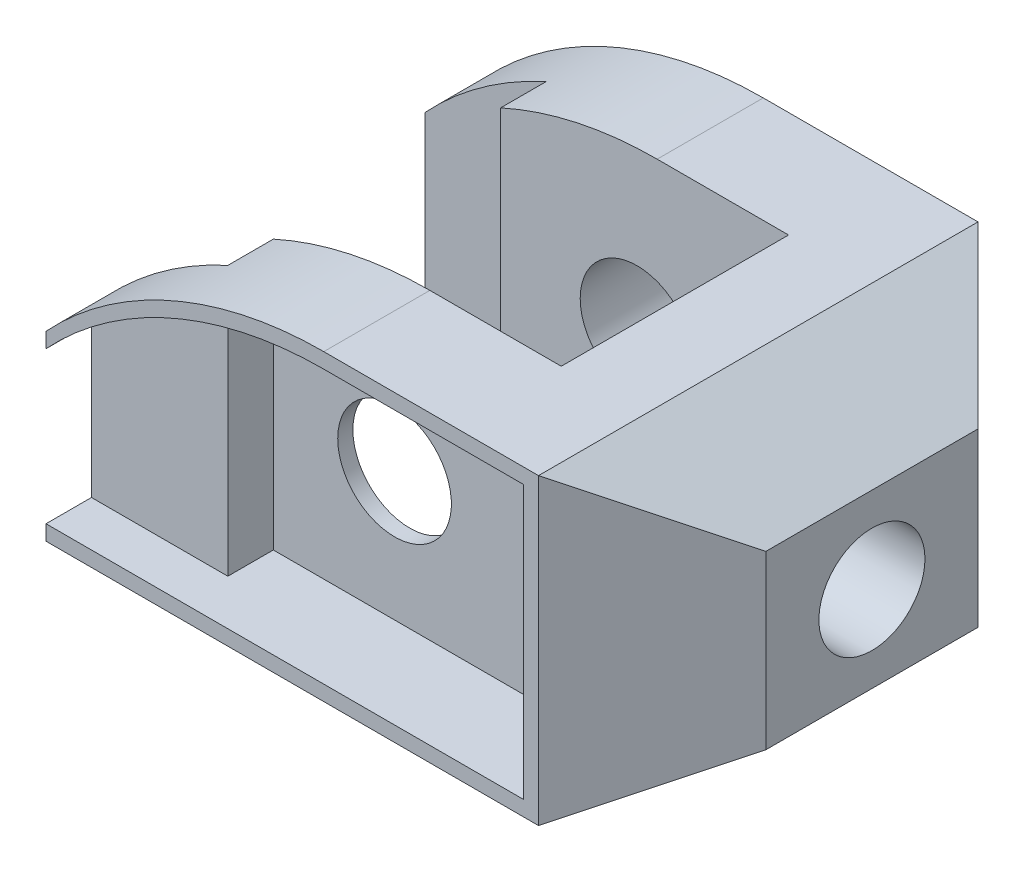
ISO-10303-21;
HEADER;
FILE_DESCRIPTION(('STEP AP214'),'2;1');
FILE_NAME('part.step','',(''),(''),'','','');
FILE_SCHEMA(('AUTOMOTIVE_DESIGN { 1 0 10303 214 1 1 1 1 }'));
ENDSEC;
DATA;
#1=APPLICATION_CONTEXT('core data for automotive mechanical design processes');
#2=APPLICATION_PROTOCOL_DEFINITION('international standard','automotive_design',2000,#1);
#3=PRODUCT_CONTEXT('',#1,'mechanical');
#4=PRODUCT('Part','Part','',(#3));
#5=PRODUCT_RELATED_PRODUCT_CATEGORY('part','',(#4));
#6=PRODUCT_DEFINITION_FORMATION('','',#4);
#7=PRODUCT_DEFINITION_CONTEXT('part definition',#1,'design');
#8=PRODUCT_DEFINITION('design','',#6,#7);
#9=PRODUCT_DEFINITION_SHAPE('','',#8);
#10=(LENGTH_UNIT() NAMED_UNIT(*) SI_UNIT(.MILLI.,.METRE.));
#11=(NAMED_UNIT(*) PLANE_ANGLE_UNIT() SI_UNIT($,.RADIAN.));
#12=(NAMED_UNIT(*) SI_UNIT($,.STERADIAN.) SOLID_ANGLE_UNIT());
#13=UNCERTAINTY_MEASURE_WITH_UNIT(LENGTH_MEASURE(1.E-05),#10,'distance_accuracy_value','');
#14=(GEOMETRIC_REPRESENTATION_CONTEXT(3) GLOBAL_UNCERTAINTY_ASSIGNED_CONTEXT((#13)) GLOBAL_UNIT_ASSIGNED_CONTEXT((#10,
#11,#12)) REPRESENTATION_CONTEXT('',''));
#15=CARTESIAN_POINT('',(0.,0.,0.));
#16=DIRECTION('',(0.,0.,1.));
#17=DIRECTION('',(1.,0.,0.));
#18=AXIS2_PLACEMENT_3D('',#15,#16,#17);
#19=CARTESIAN_POINT('',(36.6606055596467,-10.,58.));
#20=DIRECTION('',(0.,0.,-1.));
#21=DIRECTION('',(-1.,0.,0.));
#22=AXIS2_PLACEMENT_3D('',#19,#20,#21);
#23=CYLINDRICAL_SURFACE('',#22,50.);
#24=DIRECTION('',(0.,0.,-1.));
#25=VECTOR('',#24,1.);
#26=CARTESIAN_POINT('',(16.,35.5317403347236,58.));
#27=LINE('',#26,#25);
#28=CARTESIAN_POINT('',(16.,35.5317403347236,44.));
#29=VERTEX_POINT('',#28);
#30=CARTESIAN_POINT('',(16.,35.5317403347236,50.));
#31=VERTEX_POINT('',#30);
#32=EDGE_CURVE('E464',#29,#31,#27,.F.);
#33=ORIENTED_EDGE('',*,*,#32,.T.);
#34=CARTESIAN_POINT('',(36.6606055596467,-10.,50.));
#35=DIRECTION('',(0.,0.,1.));
#36=DIRECTION('',(1.,0.,0.));
#37=AXIS2_PLACEMENT_3D('',#34,#35,#36);
#38=CIRCLE('',#37,50.);
#39=CARTESIAN_POINT('',(0.,24.,50.));
#40=VERTEX_POINT('',#39);
#41=EDGE_CURVE('E368',#31,#40,#38,.T.);
#42=ORIENTED_EDGE('',*,*,#41,.T.);
#43=DIRECTION('',(0.,0.,-1.));
#44=VECTOR('',#43,1.);
#45=CARTESIAN_POINT('',(0.,24.,58.));
#46=LINE('',#45,#44);
#47=CARTESIAN_POINT('',(0.,24.,58.));
#48=VERTEX_POINT('',#47);
#49=EDGE_CURVE('E421',#48,#40,#46,.T.);
#50=ORIENTED_EDGE('',*,*,#49,.F.);
#51=CARTESIAN_POINT('',(36.6606055596467,-10.,58.));
#52=DIRECTION('',(0.,0.,1.));
#53=DIRECTION('',(-1.,0.,0.));
#54=AXIS2_PLACEMENT_3D('',#51,#52,#53);
#55=CIRCLE('',#54,50.);
#56=CARTESIAN_POINT('',(36.6606055596467,40.,58.));
#57=VERTEX_POINT('',#56);
#58=EDGE_CURVE('E393',#57,#48,#55,.T.);
#59=ORIENTED_EDGE('',*,*,#58,.F.);
#60=DIRECTION('',(0.,0.,-1.));
#61=VECTOR('',#60,1.);
#62=CARTESIAN_POINT('',(36.6606055596467,40.,58.));
#63=LINE('',#62,#61);
#64=CARTESIAN_POINT('',(36.6606055596467,40.,44.));
#65=VERTEX_POINT('',#64);
#66=EDGE_CURVE('E426',#57,#65,#63,.T.);
#67=ORIENTED_EDGE('',*,*,#66,.T.);
#68=CARTESIAN_POINT('',(36.6606055596467,-10.,44.));
#69=DIRECTION('',(0.,0.,1.));
#70=DIRECTION('',(1.,0.,0.));
#71=AXIS2_PLACEMENT_3D('',#68,#69,#70);
#72=CIRCLE('',#71,50.);
#73=EDGE_CURVE('E356',#65,#29,#72,.T.);
#74=ORIENTED_EDGE('',*,*,#73,.T.);
#75=EDGE_LOOP('',(#33,#42,#50,#59,#67,#74));
#76=FACE_BOUND('',#75,.T.);
#77=ADVANCED_FACE('F45',(#76),#23,.T.);
#78=CARTESIAN_POINT('',(0.,0.,58.));
#79=DIRECTION('',(1.,0.,0.));
#80=DIRECTION('',(0.,0.,-1.));
#81=AXIS2_PLACEMENT_3D('',#78,#79,#80);
#82=PLANE('',#81);
#83=DIRECTION('',(0.,-1.,0.));
#84=VECTOR('',#83,1.);
#85=CARTESIAN_POINT('',(0.,22.,52.));
#86=LINE('',#85,#84);
#87=CARTESIAN_POINT('',(0.,22.,52.));
#88=VERTEX_POINT('',#87);
#89=CARTESIAN_POINT('',(0.,2.,52.));
#90=VERTEX_POINT('',#89);
#91=EDGE_CURVE('E254',#88,#90,#86,.T.);
#92=ORIENTED_EDGE('',*,*,#91,.F.);
#93=DIRECTION('',(0.,0.,1.));
#94=VECTOR('',#93,1.);
#95=CARTESIAN_POINT('',(0.,22.,52.));
#96=LINE('',#95,#94);
#97=CARTESIAN_POINT('',(0.,22.,58.));
#98=VERTEX_POINT('',#97);
#99=EDGE_CURVE('E262',#88,#98,#96,.T.);
#100=ORIENTED_EDGE('',*,*,#99,.T.);
#101=DIRECTION('',(0.,-1.,0.));
#102=VECTOR('',#101,1.);
#103=CARTESIAN_POINT('',(0.,0.,58.));
#104=LINE('',#103,#102);
#105=EDGE_CURVE('E397',#48,#98,#104,.T.);
#106=ORIENTED_EDGE('',*,*,#105,.F.);
#107=ORIENTED_EDGE('',*,*,#49,.T.);
#108=DIRECTION('',(0.,-1.,0.));
#109=VECTOR('',#108,1.);
#110=CARTESIAN_POINT('',(0.,0.,50.));
#111=LINE('',#110,#109);
#112=CARTESIAN_POINT('',(0.,0.,50.));
#113=VERTEX_POINT('',#112);
#114=EDGE_CURVE('E456',#40,#113,#111,.T.);
#115=ORIENTED_EDGE('',*,*,#114,.T.);
#116=DIRECTION('',(0.,0.,-1.));
#117=VECTOR('',#116,1.);
#118=CARTESIAN_POINT('',(0.,0.,58.));
#119=LINE('',#118,#117);
#120=CARTESIAN_POINT('',(0.,0.,58.));
#121=VERTEX_POINT('',#120);
#122=EDGE_CURVE('E416',#121,#113,#119,.T.);
#123=ORIENTED_EDGE('',*,*,#122,.F.);
#124=CARTESIAN_POINT('',(0.,2.,58.));
#125=VERTEX_POINT('',#124);
#126=EDGE_CURVE('E396',#125,#121,#104,.T.);
#127=ORIENTED_EDGE('',*,*,#126,.F.);
#128=DIRECTION('',(0.,0.,1.));
#129=VECTOR('',#128,1.);
#130=CARTESIAN_POINT('',(0.,2.,52.));
#131=LINE('',#130,#129);
#132=EDGE_CURVE('E63',#90,#125,#131,.T.);
#133=ORIENTED_EDGE('',*,*,#132,.F.);
#134=EDGE_LOOP('',(#92,#100,#106,#107,#115,#123,#127,#133));
#135=FACE_BOUND('',#134,.T.);
#136=ADVANCED_FACE('F497',(#135),#82,.F.);
#137=CARTESIAN_POINT('',(34.,19.,58.));
#138=DIRECTION('',(0.,0.,-1.));
#139=DIRECTION('',(-1.,0.,0.));
#140=AXIS2_PLACEMENT_3D('',#137,#138,#139);
#141=CYLINDRICAL_SURFACE('',#140,7.5);
#142=CARTESIAN_POINT('',(34.,19.,46.));
#143=DIRECTION('',(0.,0.,-1.));
#144=DIRECTION('',(-1.,0.,0.));
#145=AXIS2_PLACEMENT_3D('',#142,#143,#144);
#146=CIRCLE('',#145,7.5);
#147=CARTESIAN_POINT('',(26.5,19.,46.));
#148=VERTEX_POINT('',#147);
#149=EDGE_CURVE('E49',#148,#148,#146,.T.);
#150=CARTESIAN_POINT('',(34.,19.,44.));
#151=DIRECTION('',(0.,0.,1.));
#152=DIRECTION('',(1.,0.,0.));
#153=AXIS2_PLACEMENT_3D('',#150,#151,#152);
#154=CIRCLE('',#153,7.5);
#155=CARTESIAN_POINT('',(26.5,19.,44.));
#156=VERTEX_POINT('',#155);
#157=EDGE_CURVE('E355',#156,#156,#154,.T.);
#158=CARTESIAN_POINT('',(26.5,19.,46.));
#159=CARTESIAN_POINT('',(26.5,19.,45.9791666666667));
#160=CARTESIAN_POINT('',(26.5,19.,45.9583333333333));
#161=CARTESIAN_POINT('',(26.5,19.,45.9166666666667));
#162=CARTESIAN_POINT('',(26.5,19.,45.8958333333333));
#163=CARTESIAN_POINT('',(26.5,19.,45.8541666666667));
#164=CARTESIAN_POINT('',(26.5,19.,45.8333333333333));
#165=CARTESIAN_POINT('',(26.5,19.,45.7916666666667));
#166=CARTESIAN_POINT('',(26.5,19.,45.7708333333333));
#167=CARTESIAN_POINT('',(26.5,19.,45.7291666666667));
#168=CARTESIAN_POINT('',(26.5,19.,45.7083333333333));
#169=CARTESIAN_POINT('',(26.5,19.,45.6666666666667));
#170=CARTESIAN_POINT('',(26.5,19.,45.6458333333333));
#171=CARTESIAN_POINT('',(26.5,19.,45.6041666666667));
#172=CARTESIAN_POINT('',(26.5,19.,45.5833333333333));
#173=CARTESIAN_POINT('',(26.5,19.,45.5416666666667));
#174=CARTESIAN_POINT('',(26.5,19.,45.5208333333333));
#175=CARTESIAN_POINT('',(26.5,19.,45.4791666666667));
#176=CARTESIAN_POINT('',(26.5,19.,45.4583333333333));
#177=CARTESIAN_POINT('',(26.5,19.,45.4166666666667));
#178=CARTESIAN_POINT('',(26.5,19.,45.3958333333333));
#179=CARTESIAN_POINT('',(26.5,19.,45.3541666666667));
#180=CARTESIAN_POINT('',(26.5,19.,45.3333333333333));
#181=CARTESIAN_POINT('',(26.5,19.,45.2916666666667));
#182=CARTESIAN_POINT('',(26.5,19.,45.2708333333333));
#183=CARTESIAN_POINT('',(26.5,19.,45.2291666666667));
#184=CARTESIAN_POINT('',(26.5,19.,45.2083333333333));
#185=CARTESIAN_POINT('',(26.5,19.,45.1666666666667));
#186=CARTESIAN_POINT('',(26.5,19.,45.1458333333333));
#187=CARTESIAN_POINT('',(26.5,19.,45.1041666666667));
#188=CARTESIAN_POINT('',(26.5,19.,45.0833333333333));
#189=CARTESIAN_POINT('',(26.5,19.,45.0416666666667));
#190=CARTESIAN_POINT('',(26.5,19.,45.0208333333333));
#191=CARTESIAN_POINT('',(26.5,19.,44.9791666666667));
#192=CARTESIAN_POINT('',(26.5,19.,44.9583333333333));
#193=CARTESIAN_POINT('',(26.5,19.,44.9166666666667));
#194=CARTESIAN_POINT('',(26.5,19.,44.8958333333333));
#195=CARTESIAN_POINT('',(26.5,19.,44.8541666666667));
#196=CARTESIAN_POINT('',(26.5,19.,44.8333333333333));
#197=CARTESIAN_POINT('',(26.5,19.,44.7916666666667));
#198=CARTESIAN_POINT('',(26.5,19.,44.7708333333333));
#199=CARTESIAN_POINT('',(26.5,19.,44.7291666666667));
#200=CARTESIAN_POINT('',(26.5,19.,44.7083333333333));
#201=CARTESIAN_POINT('',(26.5,19.,44.6666666666667));
#202=CARTESIAN_POINT('',(26.5,19.,44.6458333333333));
#203=CARTESIAN_POINT('',(26.5,19.,44.6041666666667));
#204=CARTESIAN_POINT('',(26.5,19.,44.5833333333333));
#205=CARTESIAN_POINT('',(26.5,19.,44.5416666666667));
#206=CARTESIAN_POINT('',(26.5,19.,44.5208333333333));
#207=CARTESIAN_POINT('',(26.5,19.,44.4791666666667));
#208=CARTESIAN_POINT('',(26.5,19.,44.4583333333333));
#209=CARTESIAN_POINT('',(26.5,19.,44.4166666666667));
#210=CARTESIAN_POINT('',(26.5,19.,44.3958333333333));
#211=CARTESIAN_POINT('',(26.5,19.,44.3541666666667));
#212=CARTESIAN_POINT('',(26.5,19.,44.3333333333333));
#213=CARTESIAN_POINT('',(26.5,19.,44.2916666666667));
#214=CARTESIAN_POINT('',(26.5,19.,44.2708333333333));
#215=CARTESIAN_POINT('',(26.5,19.,44.2291666666667));
#216=CARTESIAN_POINT('',(26.5,19.,44.2083333333333));
#217=CARTESIAN_POINT('',(26.5,19.,44.1666666666667));
#218=CARTESIAN_POINT('',(26.5,19.,44.1458333333333));
#219=CARTESIAN_POINT('',(26.5,19.,44.1041666666667));
#220=CARTESIAN_POINT('',(26.5,19.,44.0833333333333));
#221=CARTESIAN_POINT('',(26.5,19.,44.0416666666667));
#222=CARTESIAN_POINT('',(26.5,19.,44.0208333333333));
#223=CARTESIAN_POINT('',(26.5,19.,44.));
#224=B_SPLINE_CURVE_WITH_KNOTS('',3,(#158,#159,#160,#161,#162,#163,#164,#165,#166,#167,#168,
#169,#170,#171,#172,#173,#174,#175,#176,#177,#178,#179,#180,#181,#182,#183,#184,#185,#186,#187,
#188,#189,#190,#191,#192,#193,#194,#195,#196,#197,#198,#199,#200,#201,#202,#203,#204,#205,#206,
#207,#208,#209,#210,#211,#212,#213,#214,#215,#216,#217,#218,#219,#220,#221,#222,#223),
.UNSPECIFIED.,.F.,.F.,(4,2,2,2,2,2,2,2,2,2,2,2,2,2,2,2,2,2,2,2,2,2,2,2,2,2,2,2,2,2,2,2,4),(0.,
0.0625000000000001,0.125,0.1875,0.25,0.3125,0.375,0.4375,0.5,0.5625,0.625000000000001,
0.687500000000001,0.750000000000001,0.812500000000001,0.875000000000001,0.937500000000001,1.,
1.0625,1.125,1.1875,1.25,1.3125,1.375,1.4375,1.5,1.5625,1.625,1.6875,1.75,1.8125,1.875,1.9375,
2.),.UNSPECIFIED.);
#225=EDGE_CURVE('BSEAM504',#148,#156,#224,.T.);
#226=ORIENTED_EDGE('',*,*,#149,.F.);
#227=ORIENTED_EDGE('',*,*,#157,.F.);
#228=ORIENTED_EDGE('',*,*,#225,.T.);
#229=ORIENTED_EDGE('',*,*,#225,.F.);
#230=EDGE_LOOP('',(#226,#228,#227,#229));
#231=FACE_BOUND('',#230,.T.);
#232=ADVANCED_FACE('F504',(#231),#141,.F.);
#233=CARTESIAN_POINT('',(36.6606055596467,-10.,58.));
#234=DIRECTION('',(0.,0.,-1.));
#235=DIRECTION('',(-1.,0.,0.));
#236=AXIS2_PLACEMENT_3D('',#233,#234,#235);
#237=PLANE('',#236);
#238=ORIENTED_EDGE('',*,*,#105,.T.);
#239=CARTESIAN_POINT('',(36.6606055596467,-12.,58.));
#240=DIRECTION('',(0.,0.,1.));
#241=DIRECTION('',(-1.,0.,0.));
#242=AXIS2_PLACEMENT_3D('',#239,#240,#241);
#243=CIRCLE('',#242,50.);
#244=CARTESIAN_POINT('',(36.6606055596467,38.,58.));
#245=VERTEX_POINT('',#244);
#246=EDGE_CURVE('E263',#245,#98,#243,.T.);
#247=ORIENTED_EDGE('',*,*,#246,.F.);
#248=DIRECTION('',(-1.,0.,0.));
#249=VECTOR('',#248,1.);
#250=CARTESIAN_POINT('',(63.,38.,58.));
#251=LINE('',#250,#249);
#252=CARTESIAN_POINT('',(63.,38.,58.));
#253=VERTEX_POINT('',#252);
#254=EDGE_CURVE('E210',#253,#245,#251,.T.);
#255=ORIENTED_EDGE('',*,*,#254,.F.);
#256=DIRECTION('',(0.,1.,0.));
#257=VECTOR('',#256,1.);
#258=CARTESIAN_POINT('',(63.,2.,58.));
#259=LINE('',#258,#257);
#260=CARTESIAN_POINT('',(63.,2.,58.));
#261=VERTEX_POINT('',#260);
#262=EDGE_CURVE('E269',#261,#253,#259,.T.);
#263=ORIENTED_EDGE('',*,*,#262,.F.);
#264=DIRECTION('',(1.,0.,0.));
#265=VECTOR('',#264,1.);
#266=CARTESIAN_POINT('',(0.,2.,58.));
#267=LINE('',#266,#265);
#268=EDGE_CURVE('E266',#125,#261,#267,.T.);
#269=ORIENTED_EDGE('',*,*,#268,.F.);
#270=ORIENTED_EDGE('',*,*,#126,.T.);
#271=DIRECTION('',(1.,0.,0.));
#272=VECTOR('',#271,1.);
#273=CARTESIAN_POINT('',(0.,0.,58.));
#274=LINE('',#273,#272);
#275=CARTESIAN_POINT('',(65.,0.,58.));
#276=VERTEX_POINT('',#275);
#277=EDGE_CURVE('E385',#121,#276,#274,.T.);
#278=ORIENTED_EDGE('',*,*,#277,.T.);
#279=DIRECTION('',(0.,-1.,0.));
#280=VECTOR('',#279,1.);
#281=CARTESIAN_POINT('',(65.,58.,58.));
#282=LINE('',#281,#280);
#283=CARTESIAN_POINT('',(65.,40.,58.));
#284=VERTEX_POINT('',#283);
#285=EDGE_CURVE('E293',#284,#276,#282,.T.);
#286=ORIENTED_EDGE('',*,*,#285,.F.);
#287=DIRECTION('',(-1.,0.,0.));
#288=VECTOR('',#287,1.);
#289=CARTESIAN_POINT('',(65.,40.,58.));
#290=LINE('',#289,#288);
#291=EDGE_CURVE('E389',#284,#57,#290,.T.);
#292=ORIENTED_EDGE('',*,*,#291,.T.);
#293=ORIENTED_EDGE('',*,*,#58,.T.);
#294=EDGE_LOOP('',(#238,#247,#255,#263,#269,#270,#278,#286,#292,#293));
#295=FACE_BOUND('',#294,.T.);
#296=ADVANCED_FACE('F547',(#295),#237,.F.);
#297=CARTESIAN_POINT('',(36.6606055596467,-10.,0.));
#298=DIRECTION('',(0.,0.,-1.));
#299=DIRECTION('',(-1.,0.,0.));
#300=AXIS2_PLACEMENT_3D('',#297,#298,#299);
#301=PLANE('',#300);
#302=DIRECTION('',(0.,-1.,0.));
#303=VECTOR('',#302,1.);
#304=CARTESIAN_POINT('',(65.,58.,0.));
#305=LINE('',#304,#303);
#306=CARTESIAN_POINT('',(65.,40.,0.));
#307=VERTEX_POINT('',#306);
#308=CARTESIAN_POINT('',(65.,0.,0.));
#309=VERTEX_POINT('',#308);
#310=EDGE_CURVE('E343',#307,#309,#305,.T.);
#311=ORIENTED_EDGE('',*,*,#310,.T.);
#312=DIRECTION('',(1.,0.,0.));
#313=VECTOR('',#312,1.);
#314=CARTESIAN_POINT('',(0.,0.,0.));
#315=LINE('',#314,#313);
#316=CARTESIAN_POINT('',(0.,0.,0.));
#317=VERTEX_POINT('',#316);
#318=EDGE_CURVE('E384',#317,#309,#315,.T.);
#319=ORIENTED_EDGE('',*,*,#318,.F.);
#320=DIRECTION('',(0.,-1.,0.));
#321=VECTOR('',#320,1.);
#322=CARTESIAN_POINT('',(0.,0.,0.));
#323=LINE('',#322,#321);
#324=CARTESIAN_POINT('',(0.,24.,0.));
#325=VERTEX_POINT('',#324);
#326=EDGE_CURVE('E390',#325,#317,#323,.T.);
#327=ORIENTED_EDGE('',*,*,#326,.F.);
#328=CARTESIAN_POINT('',(36.6606055596467,-10.,0.));
#329=DIRECTION('',(0.,0.,1.));
#330=DIRECTION('',(-1.,0.,0.));
#331=AXIS2_PLACEMENT_3D('',#328,#329,#330);
#332=CIRCLE('',#331,50.);
#333=CARTESIAN_POINT('',(36.6606055596467,40.,0.));
#334=VERTEX_POINT('',#333);
#335=EDGE_CURVE('E409',#334,#325,#332,.T.);
#336=ORIENTED_EDGE('',*,*,#335,.F.);
#337=DIRECTION('',(-1.,0.,0.));
#338=VECTOR('',#337,1.);
#339=CARTESIAN_POINT('',(65.,40.,0.));
#340=LINE('',#339,#338);
#341=EDGE_CURVE('E405',#307,#334,#340,.T.);
#342=ORIENTED_EDGE('',*,*,#341,.F.);
#343=EDGE_LOOP('',(#311,#319,#327,#336,#342));
#344=FACE_BOUND('',#343,.T.);
#345=CARTESIAN_POINT('',(34.,19.,0.));
#346=DIRECTION('',(0.,0.,1.));
#347=DIRECTION('',(1.,0.,0.));
#348=AXIS2_PLACEMENT_3D('',#345,#346,#347);
#349=CIRCLE('',#348,7.5);
#350=CARTESIAN_POINT('',(26.5,19.,0.));
#351=VERTEX_POINT('',#350);
#352=EDGE_CURVE('E380',#351,#351,#349,.T.);
#353=ORIENTED_EDGE('',*,*,#352,.T.);
#354=EDGE_LOOP('',(#353));
#355=FACE_BOUND('',#354,.T.);
#356=ADVANCED_FACE('F633',(#344,#355),#301,.T.);
#357=CARTESIAN_POINT('',(0.,0.,58.));
#358=DIRECTION('',(0.,1.,0.));
#359=DIRECTION('',(0.,0.,1.));
#360=AXIS2_PLACEMENT_3D('',#357,#358,#359);
#361=PLANE('',#360);
#362=ORIENTED_EDGE('',*,*,#122,.T.);
#363=DIRECTION('',(-1.,0.,0.));
#364=VECTOR('',#363,1.);
#365=CARTESIAN_POINT('',(16.,0.,50.));
#366=LINE('',#365,#364);
#367=CARTESIAN_POINT('',(16.,0.,50.));
#368=VERTEX_POINT('',#367);
#369=EDGE_CURVE('E289',#368,#113,#366,.T.);
#370=ORIENTED_EDGE('',*,*,#369,.F.);
#371=DIRECTION('',(0.,0.,1.));
#372=VECTOR('',#371,1.);
#373=CARTESIAN_POINT('',(16.,0.,44.));
#374=LINE('',#373,#372);
#375=CARTESIAN_POINT('',(16.,0.,44.));
#376=VERTEX_POINT('',#375);
#377=EDGE_CURVE('E313',#376,#368,#374,.T.);
#378=ORIENTED_EDGE('',*,*,#377,.F.);
#379=DIRECTION('',(-1.,0.,0.));
#380=VECTOR('',#379,1.);
#381=CARTESIAN_POINT('',(54.,0.,44.));
#382=LINE('',#381,#380);
#383=CARTESIAN_POINT('',(54.,0.,44.));
#384=VERTEX_POINT('',#383);
#385=EDGE_CURVE('E309',#384,#376,#382,.T.);
#386=ORIENTED_EDGE('',*,*,#385,.F.);
#387=DIRECTION('',(0.,0.,1.));
#388=VECTOR('',#387,1.);
#389=CARTESIAN_POINT('',(54.,0.,14.));
#390=LINE('',#389,#388);
#391=CARTESIAN_POINT('',(54.,0.,14.));
#392=VERTEX_POINT('',#391);
#393=EDGE_CURVE('E305',#392,#384,#390,.T.);
#394=ORIENTED_EDGE('',*,*,#393,.F.);
#395=DIRECTION('',(1.,0.,0.));
#396=VECTOR('',#395,1.);
#397=CARTESIAN_POINT('',(16.,0.,14.));
#398=LINE('',#397,#396);
#399=CARTESIAN_POINT('',(16.,0.,14.));
#400=VERTEX_POINT('',#399);
#401=EDGE_CURVE('E301',#400,#392,#398,.T.);
#402=ORIENTED_EDGE('',*,*,#401,.F.);
#403=DIRECTION('',(0.,0.,1.));
#404=VECTOR('',#403,1.);
#405=CARTESIAN_POINT('',(16.,0.,8.));
#406=LINE('',#405,#404);
#407=CARTESIAN_POINT('',(16.,0.,8.));
#408=VERTEX_POINT('',#407);
#409=EDGE_CURVE('E297',#408,#400,#406,.T.);
#410=ORIENTED_EDGE('',*,*,#409,.F.);
#411=DIRECTION('',(1.,0.,0.));
#412=VECTOR('',#411,1.);
#413=CARTESIAN_POINT('',(0.,0.,8.));
#414=LINE('',#413,#412);
#415=CARTESIAN_POINT('',(0.,0.,8.));
#416=VERTEX_POINT('',#415);
#417=EDGE_CURVE('E292',#416,#408,#414,.T.);
#418=ORIENTED_EDGE('',*,*,#417,.F.);
#419=EDGE_CURVE('E401',#416,#317,#119,.T.);
#420=ORIENTED_EDGE('',*,*,#419,.T.);
#421=ORIENTED_EDGE('',*,*,#318,.T.);
#422=DIRECTION('',(0.,0.,-1.));
#423=VECTOR('',#422,1.);
#424=CARTESIAN_POINT('',(65.,0.,58.));
#425=LINE('',#424,#423);
#426=EDGE_CURVE('E442',#276,#309,#425,.T.);
#427=ORIENTED_EDGE('',*,*,#426,.F.);
#428=ORIENTED_EDGE('',*,*,#277,.F.);
#429=EDGE_LOOP('',(#362,#370,#378,#386,#394,#402,#410,#418,#420,#421,#427,#428));
#430=FACE_BOUND('',#429,.T.);
#431=ADVANCED_FACE('F47',(#430),#361,.F.);
#432=CARTESIAN_POINT('',(65.,0.,58.));
#433=DIRECTION('',(-0.500000000000001,0.866025403784438,0.));
#434=DIRECTION('',(-0.866025403784438,-0.500000000000001,0.));
#435=AXIS2_PLACEMENT_3D('',#432,#433,#434);
#436=PLANE('',#435);
#437=DIRECTION('',(0.,0.,-1.));
#438=VECTOR('',#437,1.);
#439=CARTESIAN_POINT('',(80.,8.66025403784441,58.));
#440=LINE('',#439,#438);
#441=CARTESIAN_POINT('',(80.,8.66025403784443,43.0000000000002));
#442=VERTEX_POINT('',#441);
#443=CARTESIAN_POINT('',(80.,8.66025403784443,14.9999999999998));
#444=VERTEX_POINT('',#443);
#445=EDGE_CURVE('E438',#442,#444,#440,.T.);
#446=ORIENTED_EDGE('',*,*,#445,.F.);
#447=DIRECTION('',(-0.65465367070798,-0.37796447300923,0.654653670707973));
#448=VECTOR('',#447,1.);
#449=CARTESIAN_POINT('',(65.,0.,58.));
#450=LINE('',#449,#448);
#451=EDGE_CURVE('E376',#442,#276,#450,.T.);
#452=ORIENTED_EDGE('',*,*,#451,.T.);
#453=ORIENTED_EDGE('',*,*,#426,.T.);
#454=DIRECTION('',(0.65465367070798,0.37796447300923,0.654653670707973));
#455=VECTOR('',#454,1.);
#456=CARTESIAN_POINT('',(89.8571428571428,14.3512781198564,24.8571428571425));
#457=LINE('',#456,#455);
#458=EDGE_CURVE('E372',#309,#444,#457,.T.);
#459=ORIENTED_EDGE('',*,*,#458,.T.);
#460=EDGE_LOOP('',(#446,#452,#453,#459));
#461=FACE_BOUND('',#460,.T.);
#462=ADVANCED_FACE('F557',(#461),#436,.F.);
#463=CARTESIAN_POINT('',(80.,8.66025403784441,58.));
#464=DIRECTION('',(-1.,0.,0.));
#465=DIRECTION('',(0.,0.,1.));
#466=AXIS2_PLACEMENT_3D('',#463,#464,#465);
#467=PLANE('',#466);
#468=CARTESIAN_POINT('',(80.,20.,29.));
#469=DIRECTION('',(1.,0.,0.));
#470=DIRECTION('',(0.,0.,-1.));
#471=AXIS2_PLACEMENT_3D('',#468,#469,#470);
#472=CIRCLE('',#471,7.);
#473=CARTESIAN_POINT('',(80.,20.,22.));
#474=VERTEX_POINT('',#473);
#475=EDGE_CURVE('E214',#474,#474,#472,.T.);
#476=ORIENTED_EDGE('',*,*,#475,.F.);
#477=EDGE_LOOP('',(#476));
#478=FACE_BOUND('',#477,.T.);
#479=DIRECTION('',(0.,0.,-1.));
#480=VECTOR('',#479,1.);
#481=CARTESIAN_POINT('',(80.,31.3397459621556,58.));
#482=LINE('',#481,#480);
#483=CARTESIAN_POINT('',(80.,31.3397459621556,43.0000000000002));
#484=VERTEX_POINT('',#483);
#485=CARTESIAN_POINT('',(80.,31.3397459621556,14.9999999999998));
#486=VERTEX_POINT('',#485);
#487=EDGE_CURVE('E434',#484,#486,#482,.T.);
#488=ORIENTED_EDGE('',*,*,#487,.F.);
#489=DIRECTION('',(0.,-1.,0.));
#490=VECTOR('',#489,1.);
#491=CARTESIAN_POINT('',(80.,58.,43.0000000000002));
#492=LINE('',#491,#490);
#493=EDGE_CURVE('E71',#484,#442,#492,.T.);
#494=ORIENTED_EDGE('',*,*,#493,.T.);
#495=ORIENTED_EDGE('',*,*,#445,.T.);
#496=DIRECTION('',(0.,-1.,0.));
#497=VECTOR('',#496,1.);
#498=CARTESIAN_POINT('',(80.,58.,14.9999999999998));
#499=LINE('',#498,#497);
#500=EDGE_CURVE('E340',#486,#444,#499,.T.);
#501=ORIENTED_EDGE('',*,*,#500,.F.);
#502=EDGE_LOOP('',(#488,#494,#495,#501));
#503=FACE_BOUND('',#502,.T.);
#504=ADVANCED_FACE('F560',(#478,#503),#467,.F.);
#505=CARTESIAN_POINT('',(80.,31.3397459621556,58.));
#506=DIRECTION('',(-0.500000000000001,-0.866025403784438,0.));
#507=DIRECTION('',(0.866025403784438,-0.500000000000001,0.));
#508=AXIS2_PLACEMENT_3D('',#505,#506,#507);
#509=PLANE('',#508);
#510=DIRECTION('',(0.,0.,-1.));
#511=VECTOR('',#510,1.);
#512=CARTESIAN_POINT('',(65.,40.,58.));
#513=LINE('',#512,#511);
#514=EDGE_CURVE('E430',#284,#307,#513,.T.);
#515=ORIENTED_EDGE('',*,*,#514,.F.);
#516=DIRECTION('',(0.65465367070798,-0.37796447300923,-0.654653670707973));
#517=VECTOR('',#516,1.);
#518=CARTESIAN_POINT('',(73.5714285714287,35.051283406946,49.4285714285714));
#519=LINE('',#518,#517);
#520=EDGE_CURVE('E11',#284,#484,#519,.T.);
#521=ORIENTED_EDGE('',*,*,#520,.T.);
#522=ORIENTED_EDGE('',*,*,#487,.T.);
#523=DIRECTION('',(-0.65465367070798,0.37796447300923,-0.654653670707973));
#524=VECTOR('',#523,1.);
#525=CARTESIAN_POINT('',(98.4285714285714,20.7000052870896,33.4285714285711));
#526=LINE('',#525,#524);
#527=EDGE_CURVE('E55',#486,#307,#526,.T.);
#528=ORIENTED_EDGE('',*,*,#527,.T.);
#529=EDGE_LOOP('',(#515,#521,#522,#528));
#530=FACE_BOUND('',#529,.T.);
#531=ADVANCED_FACE('F518',(#530),#509,.F.);
#532=CARTESIAN_POINT('',(65.,40.,58.));
#533=DIRECTION('',(0.,-1.,0.));
#534=DIRECTION('',(1.,0.,0.));
#535=AXIS2_PLACEMENT_3D('',#532,#533,#534);
#536=PLANE('',#535);
#537=DIRECTION('',(0.,0.,1.));
#538=VECTOR('',#537,1.);
#539=CARTESIAN_POINT('',(54.,40.,58.));
#540=LINE('',#539,#538);
#541=CARTESIAN_POINT('',(54.,40.,14.));
#542=VERTEX_POINT('',#541);
#543=CARTESIAN_POINT('',(54.,40.,44.));
#544=VERTEX_POINT('',#543);
#545=EDGE_CURVE('E468',#542,#544,#540,.T.);
#546=ORIENTED_EDGE('',*,*,#545,.T.);
#547=DIRECTION('',(-1.,0.,0.));
#548=VECTOR('',#547,1.);
#549=CARTESIAN_POINT('',(65.,40.,44.));
#550=LINE('',#549,#548);
#551=EDGE_CURVE('E360',#544,#65,#550,.T.);
#552=ORIENTED_EDGE('',*,*,#551,.T.);
#553=ORIENTED_EDGE('',*,*,#66,.F.);
#554=ORIENTED_EDGE('',*,*,#291,.F.);
#555=ORIENTED_EDGE('',*,*,#514,.T.);
#556=ORIENTED_EDGE('',*,*,#341,.T.);
#557=CARTESIAN_POINT('',(36.6606055596467,40.,14.));
#558=VERTEX_POINT('',#557);
#559=EDGE_CURVE('E425',#558,#334,#63,.T.);
#560=ORIENTED_EDGE('',*,*,#559,.F.);
#561=DIRECTION('',(1.,0.,0.));
#562=VECTOR('',#561,1.);
#563=CARTESIAN_POINT('',(65.,40.,14.));
#564=LINE('',#563,#562);
#565=EDGE_CURVE('E351',#558,#542,#564,.T.);
#566=ORIENTED_EDGE('',*,*,#565,.T.);
#567=EDGE_LOOP('',(#546,#552,#553,#554,#555,#556,#560,#566));
#568=FACE_BOUND('',#567,.T.);
#569=ADVANCED_FACE('F510',(#568),#536,.F.);
#570=DIRECTION('',(0.,0.,-1.));
#571=VECTOR('',#570,1.);
#572=CARTESIAN_POINT('',(16.,35.5317403347236,58.));
#573=LINE('',#572,#571);
#574=CARTESIAN_POINT('',(16.,35.5317403347236,8.));
#575=VERTEX_POINT('',#574);
#576=CARTESIAN_POINT('',(16.,35.5317403347236,14.));
#577=VERTEX_POINT('',#576);
#578=EDGE_CURVE('E460',#575,#577,#573,.F.);
#579=ORIENTED_EDGE('',*,*,#578,.T.);
#580=CARTESIAN_POINT('',(36.6606055596467,-10.,14.));
#581=DIRECTION('',(0.,0.,-1.));
#582=DIRECTION('',(-1.,0.,0.));
#583=AXIS2_PLACEMENT_3D('',#580,#581,#582);
#584=CIRCLE('',#583,50.);
#585=EDGE_CURVE('E347',#577,#558,#584,.T.);
#586=ORIENTED_EDGE('',*,*,#585,.T.);
#587=ORIENTED_EDGE('',*,*,#559,.T.);
#588=ORIENTED_EDGE('',*,*,#335,.T.);
#589=CARTESIAN_POINT('',(0.,24.,8.00000000000001));
#590=VERTEX_POINT('',#589);
#591=EDGE_CURVE('E420',#590,#325,#46,.T.);
#592=ORIENTED_EDGE('',*,*,#591,.F.);
#593=CARTESIAN_POINT('',(36.6606055596467,-10.,8.00000000000001));
#594=DIRECTION('',(0.,0.,-1.));
#595=DIRECTION('',(-1.,0.,0.));
#596=AXIS2_PLACEMENT_3D('',#593,#594,#595);
#597=CIRCLE('',#596,50.);
#598=EDGE_CURVE('E364',#590,#575,#597,.T.);
#599=ORIENTED_EDGE('',*,*,#598,.T.);
#600=EDGE_LOOP('',(#579,#586,#587,#588,#592,#599));
#601=FACE_BOUND('',#600,.T.);
#602=ADVANCED_FACE('F500',(#601),#23,.T.);
#603=ORIENTED_EDGE('',*,*,#419,.F.);
#604=DIRECTION('',(0.,1.,0.));
#605=VECTOR('',#604,1.);
#606=CARTESIAN_POINT('',(0.,0.,8.));
#607=LINE('',#606,#605);
#608=EDGE_CURVE('E446',#416,#590,#607,.T.);
#609=ORIENTED_EDGE('',*,*,#608,.T.);
#610=ORIENTED_EDGE('',*,*,#591,.T.);
#611=ORIENTED_EDGE('',*,*,#326,.T.);
#612=EDGE_LOOP('',(#603,#609,#610,#611));
#613=FACE_BOUND('',#612,.T.);
#614=ADVANCED_FACE('F507',(#613),#82,.F.);
#615=CARTESIAN_POINT('',(34.,19.,14.));
#616=DIRECTION('',(0.,0.,-1.));
#617=DIRECTION('',(-1.,0.,0.));
#618=AXIS2_PLACEMENT_3D('',#615,#616,#617);
#619=CIRCLE('',#618,7.5);
#620=CARTESIAN_POINT('',(26.5,19.,14.));
#621=VERTEX_POINT('',#620);
#622=EDGE_CURVE('E321',#621,#621,#619,.T.);
#623=CARTESIAN_POINT('',(26.5,19.,14.));
#624=CARTESIAN_POINT('',(26.5,19.,13.8541666666667));
#625=CARTESIAN_POINT('',(26.5,19.,13.7083333333333));
#626=CARTESIAN_POINT('',(26.5,19.,13.4166666666667));
#627=CARTESIAN_POINT('',(26.5,19.,13.2708333333333));
#628=CARTESIAN_POINT('',(26.5,19.,12.9791666666667));
#629=CARTESIAN_POINT('',(26.5,19.,12.8333333333333));
#630=CARTESIAN_POINT('',(26.5,19.,12.5416666666667));
#631=CARTESIAN_POINT('',(26.5,19.,12.3958333333333));
#632=CARTESIAN_POINT('',(26.5,19.,12.1041666666667));
#633=CARTESIAN_POINT('',(26.5,19.,11.9583333333333));
#634=CARTESIAN_POINT('',(26.5,19.,11.6666666666667));
#635=CARTESIAN_POINT('',(26.5,19.,11.5208333333333));
#636=CARTESIAN_POINT('',(26.5,19.,11.2291666666667));
#637=CARTESIAN_POINT('',(26.5,19.,11.0833333333333));
#638=CARTESIAN_POINT('',(26.5,19.,10.7916666666667));
#639=CARTESIAN_POINT('',(26.5,19.,10.6458333333333));
#640=CARTESIAN_POINT('',(26.5,19.,10.3541666666667));
#641=CARTESIAN_POINT('',(26.5,19.,10.2083333333333));
#642=CARTESIAN_POINT('',(26.5,19.,9.91666666666668));
#643=CARTESIAN_POINT('',(26.5,19.,9.77083333333334));
#644=CARTESIAN_POINT('',(26.5,19.,9.47916666666667));
#645=CARTESIAN_POINT('',(26.5,19.,9.33333333333334));
#646=CARTESIAN_POINT('',(26.5,19.,9.04166666666667));
#647=CARTESIAN_POINT('',(26.5,19.,8.89583333333334));
#648=CARTESIAN_POINT('',(26.5,19.,8.60416666666667));
#649=CARTESIAN_POINT('',(26.5,19.,8.45833333333334));
#650=CARTESIAN_POINT('',(26.5,19.,8.16666666666667));
#651=CARTESIAN_POINT('',(26.5,19.,8.02083333333334));
#652=CARTESIAN_POINT('',(26.5,19.,7.72916666666667));
#653=CARTESIAN_POINT('',(26.5,19.,7.58333333333334));
#654=CARTESIAN_POINT('',(26.5,19.,7.29166666666667));
#655=CARTESIAN_POINT('',(26.5,19.,7.14583333333334));
#656=CARTESIAN_POINT('',(26.5,19.,6.85416666666667));
#657=CARTESIAN_POINT('',(26.5,19.,6.70833333333334));
#658=CARTESIAN_POINT('',(26.5,19.,6.41666666666667));
#659=CARTESIAN_POINT('',(26.5,19.,6.27083333333334));
#660=CARTESIAN_POINT('',(26.5,19.,5.97916666666667));
#661=CARTESIAN_POINT('',(26.5,19.,5.83333333333334));
#662=CARTESIAN_POINT('',(26.5,19.,5.54166666666667));
#663=CARTESIAN_POINT('',(26.5,19.,5.39583333333334));
#664=CARTESIAN_POINT('',(26.5,19.,5.10416666666667));
#665=CARTESIAN_POINT('',(26.5,19.,4.95833333333334));
#666=CARTESIAN_POINT('',(26.5,19.,4.66666666666667));
#667=CARTESIAN_POINT('',(26.5,19.,4.52083333333334));
#668=CARTESIAN_POINT('',(26.5,19.,4.22916666666667));
#669=CARTESIAN_POINT('',(26.5,19.,4.08333333333334));
#670=CARTESIAN_POINT('',(26.5,19.,3.79166666666667));
#671=CARTESIAN_POINT('',(26.5,19.,3.64583333333334));
#672=CARTESIAN_POINT('',(26.5,19.,3.35416666666667));
#673=CARTESIAN_POINT('',(26.5,19.,3.20833333333334));
#674=CARTESIAN_POINT('',(26.5,19.,2.91666666666667));
#675=CARTESIAN_POINT('',(26.5,19.,2.77083333333334));
#676=CARTESIAN_POINT('',(26.5,19.,2.47916666666667));
#677=CARTESIAN_POINT('',(26.5,19.,2.33333333333334));
#678=CARTESIAN_POINT('',(26.5,19.,2.04166666666667));
#679=CARTESIAN_POINT('',(26.5,19.,1.89583333333333));
#680=CARTESIAN_POINT('',(26.5,19.,1.60416666666667));
#681=CARTESIAN_POINT('',(26.5,19.,1.45833333333333));
#682=CARTESIAN_POINT('',(26.5,19.,1.16666666666667));
#683=CARTESIAN_POINT('',(26.5,19.,1.02083333333333));
#684=CARTESIAN_POINT('',(26.5,19.,0.729166666666667));
#685=CARTESIAN_POINT('',(26.5,19.,0.583333333333334));
#686=CARTESIAN_POINT('',(26.5,19.,0.291666666666667));
#687=CARTESIAN_POINT('',(26.5,19.,0.145833333333333));
#688=CARTESIAN_POINT('',(26.5,19.,0.));
#689=B_SPLINE_CURVE_WITH_KNOTS('',3,(#623,#624,#625,#626,#627,#628,#629,#630,#631,#632,#633,
#634,#635,#636,#637,#638,#639,#640,#641,#642,#643,#644,#645,#646,#647,#648,#649,#650,#651,#652,
#653,#654,#655,#656,#657,#658,#659,#660,#661,#662,#663,#664,#665,#666,#667,#668,#669,#670,#671,
#672,#673,#674,#675,#676,#677,#678,#679,#680,#681,#682,#683,#684,#685,#686,#687,#688),
.UNSPECIFIED.,.F.,.F.,(4,2,2,2,2,2,2,2,2,2,2,2,2,2,2,2,2,2,2,2,2,2,2,2,2,2,2,2,2,2,2,2,4),(0.,
0.4375,0.875000000000001,1.3125,1.75,2.1875,2.625,3.0625,3.5,3.9375,4.375,4.8125,5.25,
5.68750000000001,6.12500000000001,6.56250000000001,7.00000000000001,7.43750000000001,
7.87500000000001,8.31250000000001,8.75000000000001,9.18750000000001,9.62500000000001,10.0625,
10.5,10.9375,11.375,11.8125,12.25,12.6875,13.125,13.5625,14.),.UNSPECIFIED.);
#690=EDGE_CURVE('BSEAM516',#621,#351,#689,.T.);
#691=ORIENTED_EDGE('',*,*,#622,.F.);
#692=ORIENTED_EDGE('',*,*,#352,.F.);
#693=ORIENTED_EDGE('',*,*,#690,.T.);
#694=ORIENTED_EDGE('',*,*,#690,.F.);
#695=EDGE_LOOP('',(#691,#693,#692,#694));
#696=FACE_BOUND('',#695,.T.);
#697=ADVANCED_FACE('F516',(#696),#141,.F.);
#698=CARTESIAN_POINT('',(54.,58.,14.));
#699=DIRECTION('',(1.,0.,0.));
#700=DIRECTION('',(0.,0.,-1.));
#701=AXIS2_PLACEMENT_3D('',#698,#699,#700);
#702=PLANE('',#701);
#703=CARTESIAN_POINT('',(54.,20.,29.));
#704=DIRECTION('',(1.,0.,0.));
#705=DIRECTION('',(0.,0.,-1.));
#706=AXIS2_PLACEMENT_3D('',#703,#704,#705);
#707=CIRCLE('',#706,7.);
#708=CARTESIAN_POINT('',(54.,20.,22.));
#709=VERTEX_POINT('',#708);
#710=EDGE_CURVE('E288',#709,#709,#707,.T.);
#711=ORIENTED_EDGE('',*,*,#710,.T.);
#712=EDGE_LOOP('',(#711));
#713=FACE_BOUND('',#712,.T.);
#714=DIRECTION('',(0.,-1.,0.));
#715=VECTOR('',#714,1.);
#716=CARTESIAN_POINT('',(54.,58.,14.));
#717=LINE('',#716,#715);
#718=EDGE_CURVE('E328',#542,#392,#717,.T.);
#719=ORIENTED_EDGE('',*,*,#718,.T.);
#720=ORIENTED_EDGE('',*,*,#393,.T.);
#721=DIRECTION('',(0.,-1.,0.));
#722=VECTOR('',#721,1.);
#723=CARTESIAN_POINT('',(54.,58.,44.));
#724=LINE('',#723,#722);
#725=EDGE_CURVE('E325',#544,#384,#724,.T.);
#726=ORIENTED_EDGE('',*,*,#725,.F.);
#727=ORIENTED_EDGE('',*,*,#545,.F.);
#728=EDGE_LOOP('',(#719,#720,#726,#727));
#729=FACE_BOUND('',#728,.T.);
#730=ADVANCED_FACE('F478',(#713,#729),#702,.F.);
#731=CARTESIAN_POINT('',(16.,58.,44.));
#732=DIRECTION('',(1.,0.,0.));
#733=DIRECTION('',(0.,0.,-1.));
#734=AXIS2_PLACEMENT_3D('',#731,#732,#733);
#735=PLANE('',#734);
#736=DIRECTION('',(0.,-1.,0.));
#737=VECTOR('',#736,1.);
#738=CARTESIAN_POINT('',(16.,58.,44.));
#739=LINE('',#738,#737);
#740=EDGE_CURVE('E322',#29,#376,#739,.T.);
#741=ORIENTED_EDGE('',*,*,#740,.T.);
#742=ORIENTED_EDGE('',*,*,#377,.T.);
#743=DIRECTION('',(0.,-1.,0.));
#744=VECTOR('',#743,1.);
#745=CARTESIAN_POINT('',(16.,58.,50.));
#746=LINE('',#745,#744);
#747=EDGE_CURVE('E318',#31,#368,#746,.T.);
#748=ORIENTED_EDGE('',*,*,#747,.F.);
#749=ORIENTED_EDGE('',*,*,#32,.F.);
#750=EDGE_LOOP('',(#741,#742,#748,#749));
#751=FACE_BOUND('',#750,.T.);
#752=ADVANCED_FACE('F614',(#751),#735,.F.);
#753=CARTESIAN_POINT('',(16.,58.,8.));
#754=DIRECTION('',(1.,0.,0.));
#755=DIRECTION('',(0.,0.,-1.));
#756=AXIS2_PLACEMENT_3D('',#753,#754,#755);
#757=PLANE('',#756);
#758=DIRECTION('',(0.,-1.,0.));
#759=VECTOR('',#758,1.);
#760=CARTESIAN_POINT('',(16.,58.,8.));
#761=LINE('',#760,#759);
#762=EDGE_CURVE('E317',#575,#408,#761,.T.);
#763=ORIENTED_EDGE('',*,*,#762,.T.);
#764=ORIENTED_EDGE('',*,*,#409,.T.);
#765=DIRECTION('',(0.,-1.,0.));
#766=VECTOR('',#765,1.);
#767=CARTESIAN_POINT('',(16.,58.,14.));
#768=LINE('',#767,#766);
#769=EDGE_CURVE('E331',#577,#400,#768,.T.);
#770=ORIENTED_EDGE('',*,*,#769,.F.);
#771=ORIENTED_EDGE('',*,*,#578,.F.);
#772=EDGE_LOOP('',(#763,#764,#770,#771));
#773=FACE_BOUND('',#772,.T.);
#774=ADVANCED_FACE('F525',(#773),#757,.F.);
#775=CARTESIAN_POINT('',(16.,58.,50.));
#776=DIRECTION('',(0.,0.,1.));
#777=DIRECTION('',(1.,0.,0.));
#778=AXIS2_PLACEMENT_3D('',#775,#776,#777);
#779=PLANE('',#778);
#780=ORIENTED_EDGE('',*,*,#747,.T.);
#781=ORIENTED_EDGE('',*,*,#369,.T.);
#782=ORIENTED_EDGE('',*,*,#114,.F.);
#783=ORIENTED_EDGE('',*,*,#41,.F.);
#784=EDGE_LOOP('',(#780,#781,#782,#783));
#785=FACE_BOUND('',#784,.T.);
#786=ADVANCED_FACE('F616',(#785),#779,.F.);
#787=CARTESIAN_POINT('',(0.,58.,8.));
#788=DIRECTION('',(0.,0.,-1.));
#789=DIRECTION('',(-1.,0.,0.));
#790=AXIS2_PLACEMENT_3D('',#787,#788,#789);
#791=PLANE('',#790);
#792=ORIENTED_EDGE('',*,*,#608,.F.);
#793=ORIENTED_EDGE('',*,*,#417,.T.);
#794=ORIENTED_EDGE('',*,*,#762,.F.);
#795=ORIENTED_EDGE('',*,*,#598,.F.);
#796=EDGE_LOOP('',(#792,#793,#794,#795));
#797=FACE_BOUND('',#796,.T.);
#798=ADVANCED_FACE('F527',(#797),#791,.F.);
#799=CARTESIAN_POINT('',(54.,58.,44.));
#800=DIRECTION('',(0.,0.,1.));
#801=DIRECTION('',(1.,0.,0.));
#802=AXIS2_PLACEMENT_3D('',#799,#800,#801);
#803=PLANE('',#802);
#804=ORIENTED_EDGE('',*,*,#157,.T.);
#805=EDGE_LOOP('',(#804));
#806=FACE_BOUND('',#805,.T.);
#807=ORIENTED_EDGE('',*,*,#725,.T.);
#808=ORIENTED_EDGE('',*,*,#385,.T.);
#809=ORIENTED_EDGE('',*,*,#740,.F.);
#810=ORIENTED_EDGE('',*,*,#73,.F.);
#811=ORIENTED_EDGE('',*,*,#551,.F.);
#812=EDGE_LOOP('',(#807,#808,#809,#810,#811));
#813=FACE_BOUND('',#812,.T.);
#814=ADVANCED_FACE('F605',(#806,#813),#803,.F.);
#815=CARTESIAN_POINT('',(16.,58.,14.));
#816=DIRECTION('',(0.,0.,-1.));
#817=DIRECTION('',(-1.,0.,0.));
#818=AXIS2_PLACEMENT_3D('',#815,#816,#817);
#819=PLANE('',#818);
#820=ORIENTED_EDGE('',*,*,#622,.T.);
#821=EDGE_LOOP('',(#820));
#822=FACE_BOUND('',#821,.T.);
#823=ORIENTED_EDGE('',*,*,#585,.F.);
#824=ORIENTED_EDGE('',*,*,#769,.T.);
#825=ORIENTED_EDGE('',*,*,#401,.T.);
#826=ORIENTED_EDGE('',*,*,#718,.F.);
#827=ORIENTED_EDGE('',*,*,#565,.F.);
#828=EDGE_LOOP('',(#823,#824,#825,#826,#827));
#829=FACE_BOUND('',#828,.T.);
#830=ADVANCED_FACE('F537',(#822,#829),#819,.F.);
#831=CARTESIAN_POINT('',(65.,58.,0.));
#832=DIRECTION('',(-0.707106781186544,0.,0.707106781186551));
#833=DIRECTION('',(0.707106781186551,0.,0.707106781186544));
#834=AXIS2_PLACEMENT_3D('',#831,#832,#833);
#835=PLANE('',#834);
#836=ORIENTED_EDGE('',*,*,#310,.F.);
#837=ORIENTED_EDGE('',*,*,#527,.F.);
#838=ORIENTED_EDGE('',*,*,#500,.T.);
#839=ORIENTED_EDGE('',*,*,#458,.F.);
#840=EDGE_LOOP('',(#836,#837,#838,#839));
#841=FACE_BOUND('',#840,.T.);
#842=ADVANCED_FACE('F493',(#841),#835,.F.);
#843=CARTESIAN_POINT('',(65.,58.,58.));
#844=DIRECTION('',(-0.707106781186543,0.,-0.707106781186552));
#845=DIRECTION('',(-0.707106781186552,0.,0.707106781186543));
#846=AXIS2_PLACEMENT_3D('',#843,#844,#845);
#847=PLANE('',#846);
#848=ORIENTED_EDGE('',*,*,#493,.F.);
#849=ORIENTED_EDGE('',*,*,#520,.F.);
#850=ORIENTED_EDGE('',*,*,#285,.T.);
#851=ORIENTED_EDGE('',*,*,#451,.F.);
#852=EDGE_LOOP('',(#848,#849,#850,#851));
#853=FACE_BOUND('',#852,.T.);
#854=ADVANCED_FACE('F483',(#853),#847,.F.);
#855=CARTESIAN_POINT('',(22.,20.,29.));
#856=DIRECTION('',(1.,0.,0.));
#857=DIRECTION('',(0.,0.,-1.));
#858=AXIS2_PLACEMENT_3D('',#855,#856,#857);
#859=CYLINDRICAL_SURFACE('',#858,7.);
#860=CARTESIAN_POINT('',(80.,20.,22.));
#861=CARTESIAN_POINT('',(79.7291666666667,20.,22.));
#862=CARTESIAN_POINT('',(79.4583333333333,20.,22.));
#863=CARTESIAN_POINT('',(78.9166666666667,20.,22.));
#864=CARTESIAN_POINT('',(78.6458333333333,20.,22.));
#865=CARTESIAN_POINT('',(78.1041666666667,20.,22.));
#866=CARTESIAN_POINT('',(77.8333333333333,20.,22.));
#867=CARTESIAN_POINT('',(77.2916666666667,20.,22.));
#868=CARTESIAN_POINT('',(77.0208333333333,20.,22.));
#869=CARTESIAN_POINT('',(76.4791666666667,20.,22.));
#870=CARTESIAN_POINT('',(76.2083333333333,20.,22.));
#871=CARTESIAN_POINT('',(75.6666666666667,20.,22.));
#872=CARTESIAN_POINT('',(75.3958333333333,20.,22.));
#873=CARTESIAN_POINT('',(74.8541666666667,20.,22.));
#874=CARTESIAN_POINT('',(74.5833333333333,20.,22.));
#875=CARTESIAN_POINT('',(74.0416666666667,20.,22.));
#876=CARTESIAN_POINT('',(73.7708333333333,20.,22.));
#877=CARTESIAN_POINT('',(73.2291666666667,20.,22.));
#878=CARTESIAN_POINT('',(72.9583333333333,20.,22.));
#879=CARTESIAN_POINT('',(72.4166666666667,20.,22.));
#880=CARTESIAN_POINT('',(72.1458333333333,20.,22.));
#881=CARTESIAN_POINT('',(71.6041666666667,20.,22.));
#882=CARTESIAN_POINT('',(71.3333333333333,20.,22.));
#883=CARTESIAN_POINT('',(70.7916666666667,20.,22.));
#884=CARTESIAN_POINT('',(70.5208333333333,20.,22.));
#885=CARTESIAN_POINT('',(69.9791666666667,20.,22.));
#886=CARTESIAN_POINT('',(69.7083333333333,20.,22.));
#887=CARTESIAN_POINT('',(69.1666666666667,20.,22.));
#888=CARTESIAN_POINT('',(68.8958333333333,20.,22.));
#889=CARTESIAN_POINT('',(68.3541666666667,20.,22.));
#890=CARTESIAN_POINT('',(68.0833333333333,20.,22.));
#891=CARTESIAN_POINT('',(67.5416666666667,20.,22.));
#892=CARTESIAN_POINT('',(67.2708333333333,20.,22.));
#893=CARTESIAN_POINT('',(66.7291666666667,20.,22.));
#894=CARTESIAN_POINT('',(66.4583333333333,20.,22.));
#895=CARTESIAN_POINT('',(65.9166666666667,20.,22.));
#896=CARTESIAN_POINT('',(65.6458333333333,20.,22.));
#897=CARTESIAN_POINT('',(65.1041666666667,20.,22.));
#898=CARTESIAN_POINT('',(64.8333333333333,20.,22.));
#899=CARTESIAN_POINT('',(64.2916666666667,20.,22.));
#900=CARTESIAN_POINT('',(64.0208333333333,20.,22.));
#901=CARTESIAN_POINT('',(63.4791666666667,20.,22.));
#902=CARTESIAN_POINT('',(63.2083333333333,20.,22.));
#903=CARTESIAN_POINT('',(62.6666666666667,20.,22.));
#904=CARTESIAN_POINT('',(62.3958333333333,20.,22.));
#905=CARTESIAN_POINT('',(61.8541666666667,20.,22.));
#906=CARTESIAN_POINT('',(61.5833333333333,20.,22.));
#907=CARTESIAN_POINT('',(61.0416666666667,20.,22.));
#908=CARTESIAN_POINT('',(60.7708333333333,20.,22.));
#909=CARTESIAN_POINT('',(60.2291666666667,20.,22.));
#910=CARTESIAN_POINT('',(59.9583333333333,20.,22.));
#911=CARTESIAN_POINT('',(59.4166666666667,20.,22.));
#912=CARTESIAN_POINT('',(59.1458333333333,20.,22.));
#913=CARTESIAN_POINT('',(58.6041666666667,20.,22.));
#914=CARTESIAN_POINT('',(58.3333333333333,20.,22.));
#915=CARTESIAN_POINT('',(57.7916666666667,20.,22.));
#916=CARTESIAN_POINT('',(57.5208333333333,20.,22.));
#917=CARTESIAN_POINT('',(56.9791666666667,20.,22.));
#918=CARTESIAN_POINT('',(56.7083333333333,20.,22.));
#919=CARTESIAN_POINT('',(56.1666666666667,20.,22.));
#920=CARTESIAN_POINT('',(55.8958333333333,20.,22.));
#921=CARTESIAN_POINT('',(55.3541666666667,20.,22.));
#922=CARTESIAN_POINT('',(55.0833333333333,20.,22.));
#923=CARTESIAN_POINT('',(54.5416666666667,20.,22.));
#924=CARTESIAN_POINT('',(54.2708333333333,20.,22.));
#925=CARTESIAN_POINT('',(54.,20.,22.));
#926=B_SPLINE_CURVE_WITH_KNOTS('',3,(#860,#861,#862,#863,#864,#865,#866,#867,#868,#869,#870,
#871,#872,#873,#874,#875,#876,#877,#878,#879,#880,#881,#882,#883,#884,#885,#886,#887,#888,#889,
#890,#891,#892,#893,#894,#895,#896,#897,#898,#899,#900,#901,#902,#903,#904,#905,#906,#907,#908,
#909,#910,#911,#912,#913,#914,#915,#916,#917,#918,#919,#920,#921,#922,#923,#924,#925),
.UNSPECIFIED.,.F.,.F.,(4,2,2,2,2,2,2,2,2,2,2,2,2,2,2,2,2,2,2,2,2,2,2,2,2,2,2,2,2,2,2,2,4),(0.,
0.812500000000008,1.625,2.4375,3.25,4.0625,4.875,5.6875,6.49999999999999,7.3125,
8.12500000000001,8.9375,9.74999999999999,10.5625,11.375,12.1875,13.,13.8125,14.625,15.4375,
16.25,17.0625,17.875,18.6875,19.5,20.3125,21.125,21.9375,22.75,23.5625,24.375,25.1875,26.),.UNSPECIFIED.);
#927=EDGE_CURVE('BSEAM481',#474,#709,#926,.T.);
#928=ORIENTED_EDGE('',*,*,#475,.T.);
#929=ORIENTED_EDGE('',*,*,#710,.F.);
#930=ORIENTED_EDGE('',*,*,#927,.T.);
#931=ORIENTED_EDGE('',*,*,#927,.F.);
#932=EDGE_LOOP('',(#928,#930,#929,#931));
#933=FACE_BOUND('',#932,.T.);
#934=ADVANCED_FACE('F481',(#933),#859,.F.);
#935=CARTESIAN_POINT('',(36.6606055596467,-12.,52.));
#936=DIRECTION('',(0.,0.,1.));
#937=DIRECTION('',(1.,0.,0.));
#938=AXIS2_PLACEMENT_3D('',#935,#936,#937);
#939=CYLINDRICAL_SURFACE('',#938,50.);
#940=ORIENTED_EDGE('',*,*,#246,.T.);
#941=ORIENTED_EDGE('',*,*,#99,.F.);
#942=CARTESIAN_POINT('',(36.6606055596467,-12.,52.));
#943=DIRECTION('',(0.,0.,1.));
#944=DIRECTION('',(-1.,0.,0.));
#945=AXIS2_PLACEMENT_3D('',#942,#943,#944);
#946=CIRCLE('',#945,50.);
#947=CARTESIAN_POINT('',(18.,34.3873021434453,52.));
#948=VERTEX_POINT('',#947);
#949=EDGE_CURVE('E251',#948,#88,#946,.T.);
#950=ORIENTED_EDGE('',*,*,#949,.F.);
#951=DIRECTION('',(0.,0.,1.));
#952=VECTOR('',#951,1.);
#953=CARTESIAN_POINT('',(18.,34.3873021434453,46.));
#954=LINE('',#953,#952);
#955=CARTESIAN_POINT('',(18.,34.3873021434453,46.));
#956=VERTEX_POINT('',#955);
#957=EDGE_CURVE('E221',#956,#948,#954,.T.);
#958=ORIENTED_EDGE('',*,*,#957,.F.);
#959=CARTESIAN_POINT('',(36.6606055596467,-12.,46.));
#960=DIRECTION('',(0.,0.,1.));
#961=DIRECTION('',(-1.,0.,0.));
#962=AXIS2_PLACEMENT_3D('',#959,#960,#961);
#963=CIRCLE('',#962,50.);
#964=CARTESIAN_POINT('',(36.6606055596467,38.,46.));
#965=VERTEX_POINT('',#964);
#966=EDGE_CURVE('E218',#965,#956,#963,.T.);
#967=ORIENTED_EDGE('',*,*,#966,.F.);
#968=DIRECTION('',(0.,0.,1.));
#969=VECTOR('',#968,1.);
#970=CARTESIAN_POINT('',(36.6606055596467,38.,52.));
#971=LINE('',#970,#969);
#972=EDGE_CURVE('E203',#965,#245,#971,.T.);
#973=ORIENTED_EDGE('',*,*,#972,.T.);
#974=EDGE_LOOP('',(#940,#941,#950,#958,#967,#973));
#975=FACE_BOUND('',#974,.T.);
#976=ADVANCED_FACE('F219',(#975),#939,.F.);
#977=CARTESIAN_POINT('',(63.,38.,52.));
#978=DIRECTION('',(0.,1.,0.));
#979=DIRECTION('',(0.,0.,1.));
#980=AXIS2_PLACEMENT_3D('',#977,#978,#979);
#981=PLANE('',#980);
#982=ORIENTED_EDGE('',*,*,#254,.T.);
#983=ORIENTED_EDGE('',*,*,#972,.F.);
#984=DIRECTION('',(-1.,0.,0.));
#985=VECTOR('',#984,1.);
#986=CARTESIAN_POINT('',(63.,38.,46.));
#987=LINE('',#986,#985);
#988=CARTESIAN_POINT('',(63.,38.,46.));
#989=VERTEX_POINT('',#988);
#990=EDGE_CURVE('E207',#989,#965,#987,.T.);
#991=ORIENTED_EDGE('',*,*,#990,.F.);
#992=DIRECTION('',(0.,0.,1.));
#993=VECTOR('',#992,1.);
#994=CARTESIAN_POINT('',(63.,38.,52.));
#995=LINE('',#994,#993);
#996=EDGE_CURVE('E215',#989,#253,#995,.T.);
#997=ORIENTED_EDGE('',*,*,#996,.T.);
#998=EDGE_LOOP('',(#982,#983,#991,#997));
#999=FACE_BOUND('',#998,.T.);
#1000=ADVANCED_FACE('F205',(#999),#981,.F.);
#1001=CARTESIAN_POINT('',(63.,2.,52.));
#1002=DIRECTION('',(1.,0.,0.));
#1003=DIRECTION('',(0.,0.,-1.));
#1004=AXIS2_PLACEMENT_3D('',#1001,#1002,#1003);
#1005=PLANE('',#1004);
#1006=ORIENTED_EDGE('',*,*,#262,.T.);
#1007=ORIENTED_EDGE('',*,*,#996,.F.);
#1008=DIRECTION('',(0.,1.,0.));
#1009=VECTOR('',#1008,1.);
#1010=CARTESIAN_POINT('',(63.,38.,46.));
#1011=LINE('',#1010,#1009);
#1012=CARTESIAN_POINT('',(63.,2.,46.));
#1013=VERTEX_POINT('',#1012);
#1014=EDGE_CURVE('E231',#1013,#989,#1011,.T.);
#1015=ORIENTED_EDGE('',*,*,#1014,.F.);
#1016=DIRECTION('',(0.,0.,1.));
#1017=VECTOR('',#1016,1.);
#1018=CARTESIAN_POINT('',(63.,2.,52.));
#1019=LINE('',#1018,#1017);
#1020=EDGE_CURVE('E277',#1013,#261,#1019,.T.);
#1021=ORIENTED_EDGE('',*,*,#1020,.T.);
#1022=EDGE_LOOP('',(#1006,#1007,#1015,#1021));
#1023=FACE_BOUND('',#1022,.T.);
#1024=ADVANCED_FACE('F577',(#1023),#1005,.F.);
#1025=CARTESIAN_POINT('',(0.,2.,52.));
#1026=DIRECTION('',(0.,-1.,0.));
#1027=DIRECTION('',(1.,0.,0.));
#1028=AXIS2_PLACEMENT_3D('',#1025,#1026,#1027);
#1029=PLANE('',#1028);
#1030=ORIENTED_EDGE('',*,*,#268,.T.);
#1031=ORIENTED_EDGE('',*,*,#1020,.F.);
#1032=DIRECTION('',(1.,0.,0.));
#1033=VECTOR('',#1032,1.);
#1034=CARTESIAN_POINT('',(63.,2.,46.));
#1035=LINE('',#1034,#1033);
#1036=CARTESIAN_POINT('',(18.,2.,46.));
#1037=VERTEX_POINT('',#1036);
#1038=EDGE_CURVE('E241',#1037,#1013,#1035,.T.);
#1039=ORIENTED_EDGE('',*,*,#1038,.F.);
#1040=DIRECTION('',(0.,0.,1.));
#1041=VECTOR('',#1040,1.);
#1042=CARTESIAN_POINT('',(18.,2.,46.));
#1043=LINE('',#1042,#1041);
#1044=CARTESIAN_POINT('',(18.,2.,52.));
#1045=VERTEX_POINT('',#1044);
#1046=EDGE_CURVE('E246',#1037,#1045,#1043,.T.);
#1047=ORIENTED_EDGE('',*,*,#1046,.T.);
#1048=DIRECTION('',(1.,0.,0.));
#1049=VECTOR('',#1048,1.);
#1050=CARTESIAN_POINT('',(0.,2.,52.));
#1051=LINE('',#1050,#1049);
#1052=EDGE_CURVE('E258',#90,#1045,#1051,.T.);
#1053=ORIENTED_EDGE('',*,*,#1052,.F.);
#1054=ORIENTED_EDGE('',*,*,#132,.T.);
#1055=EDGE_LOOP('',(#1030,#1031,#1039,#1047,#1053,#1054));
#1056=FACE_BOUND('',#1055,.T.);
#1057=ADVANCED_FACE('F578',(#1056),#1029,.F.);
#1058=CARTESIAN_POINT('',(36.6606055596467,-12.,52.));
#1059=DIRECTION('',(0.,0.,-1.));
#1060=DIRECTION('',(-1.,0.,0.));
#1061=AXIS2_PLACEMENT_3D('',#1058,#1059,#1060);
#1062=PLANE('',#1061);
#1063=ORIENTED_EDGE('',*,*,#1052,.T.);
#1064=DIRECTION('',(0.,-1.,0.));
#1065=VECTOR('',#1064,1.);
#1066=CARTESIAN_POINT('',(18.,2.,52.));
#1067=LINE('',#1066,#1065);
#1068=EDGE_CURVE('E233',#948,#1045,#1067,.T.);
#1069=ORIENTED_EDGE('',*,*,#1068,.F.);
#1070=ORIENTED_EDGE('',*,*,#949,.T.);
#1071=ORIENTED_EDGE('',*,*,#91,.T.);
#1072=EDGE_LOOP('',(#1063,#1069,#1070,#1071));
#1073=FACE_BOUND('',#1072,.T.);
#1074=ADVANCED_FACE('F571',(#1073),#1062,.F.);
#1075=CARTESIAN_POINT('',(18.,2.,46.));
#1076=DIRECTION('',(-1.,0.,0.));
#1077=DIRECTION('',(0.,0.,1.));
#1078=AXIS2_PLACEMENT_3D('',#1075,#1076,#1077);
#1079=PLANE('',#1078);
#1080=ORIENTED_EDGE('',*,*,#1068,.T.);
#1081=ORIENTED_EDGE('',*,*,#1046,.F.);
#1082=DIRECTION('',(0.,-1.,0.));
#1083=VECTOR('',#1082,1.);
#1084=CARTESIAN_POINT('',(18.,2.,46.));
#1085=LINE('',#1084,#1083);
#1086=EDGE_CURVE('E226',#956,#1037,#1085,.T.);
#1087=ORIENTED_EDGE('',*,*,#1086,.F.);
#1088=ORIENTED_EDGE('',*,*,#957,.T.);
#1089=EDGE_LOOP('',(#1080,#1081,#1087,#1088));
#1090=FACE_BOUND('',#1089,.T.);
#1091=ADVANCED_FACE('F574',(#1090),#1079,.F.);
#1092=CARTESIAN_POINT('',(36.6606055596467,-12.,46.));
#1093=DIRECTION('',(0.,0.,-1.));
#1094=DIRECTION('',(-1.,0.,0.));
#1095=AXIS2_PLACEMENT_3D('',#1092,#1093,#1094);
#1096=PLANE('',#1095);
#1097=ORIENTED_EDGE('',*,*,#149,.T.);
#1098=EDGE_LOOP('',(#1097));
#1099=FACE_BOUND('',#1098,.T.);
#1100=ORIENTED_EDGE('',*,*,#990,.T.);
#1101=ORIENTED_EDGE('',*,*,#966,.T.);
#1102=ORIENTED_EDGE('',*,*,#1086,.T.);
#1103=ORIENTED_EDGE('',*,*,#1038,.T.);
#1104=ORIENTED_EDGE('',*,*,#1014,.T.);
#1105=EDGE_LOOP('',(#1100,#1101,#1102,#1103,#1104));
#1106=FACE_BOUND('',#1105,.T.);
#1107=ADVANCED_FACE('F228',(#1099,#1106),#1096,.F.);
#1108=CLOSED_SHELL('',(#77,#136,#232,#296,#356,#431,#462,#504,#531,#569,#602,#614,#697,#730,
#752,#774,#786,#798,#814,#830,#842,#854,#934,#976,#1000,#1024,#1057,#1074,#1091,#1107));
#1109=MANIFOLD_SOLID_BREP('B2',#1108);
#1110=ADVANCED_BREP_SHAPE_REPRESENTATION('',(#18,#1109),#14);
#1111=SHAPE_DEFINITION_REPRESENTATION(#9,#1110);
ENDSEC;
END-ISO-10303-21;
